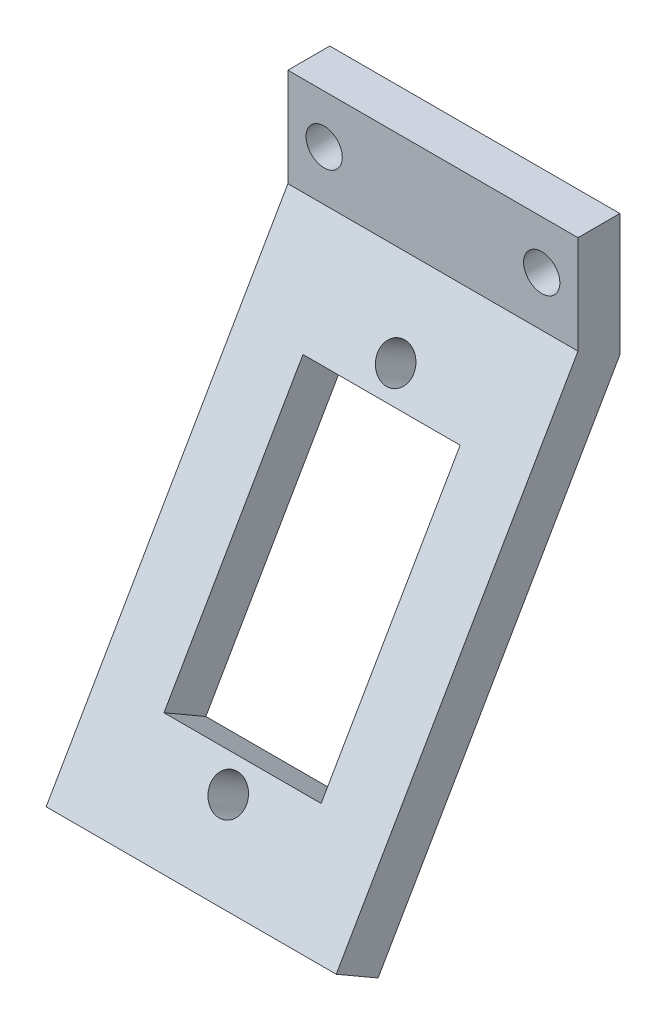
ISO-10303-21;
HEADER;
FILE_DESCRIPTION(('STEP AP214'),'2;1');
FILE_NAME('part.step','',(''),(''),'','','');
FILE_SCHEMA(('AUTOMOTIVE_DESIGN { 1 0 10303 214 1 1 1 1 }'));
ENDSEC;
DATA;
#1=APPLICATION_CONTEXT('core data for automotive mechanical design processes');
#2=APPLICATION_PROTOCOL_DEFINITION('international standard','automotive_design',2000,#1);
#3=PRODUCT_CONTEXT('',#1,'mechanical');
#4=PRODUCT('Part','Part','',(#3));
#5=PRODUCT_RELATED_PRODUCT_CATEGORY('part','',(#4));
#6=PRODUCT_DEFINITION_FORMATION('','',#4);
#7=PRODUCT_DEFINITION_CONTEXT('part definition',#1,'design');
#8=PRODUCT_DEFINITION('design','',#6,#7);
#9=PRODUCT_DEFINITION_SHAPE('','',#8);
#10=(LENGTH_UNIT() NAMED_UNIT(*) SI_UNIT(.MILLI.,.METRE.));
#11=(NAMED_UNIT(*) PLANE_ANGLE_UNIT() SI_UNIT($,.RADIAN.));
#12=(NAMED_UNIT(*) SI_UNIT($,.STERADIAN.) SOLID_ANGLE_UNIT());
#13=UNCERTAINTY_MEASURE_WITH_UNIT(LENGTH_MEASURE(1.E-05),#10,'distance_accuracy_value','');
#14=(GEOMETRIC_REPRESENTATION_CONTEXT(3) GLOBAL_UNCERTAINTY_ASSIGNED_CONTEXT((#13)) GLOBAL_UNIT_ASSIGNED_CONTEXT((#10,
#11,#12)) REPRESENTATION_CONTEXT('',''));
#15=CARTESIAN_POINT('',(0.,0.,0.));
#16=DIRECTION('',(0.,0.,1.));
#17=DIRECTION('',(1.,0.,0.));
#18=AXIS2_PLACEMENT_3D('',#15,#16,#17);
#19=CARTESIAN_POINT('',(0.,45.0000000000001,77.9422863405994));
#20=DIRECTION('',(0.,-0.500000000000001,-0.866025403784438));
#21=DIRECTION('',(0.,0.866025403784438,-0.500000000000001));
#22=AXIS2_PLACEMENT_3D('',#19,#20,#21);
#23=PLANE('',#22);
#24=CARTESIAN_POINT('',(0.,61.5410852122829,68.3922863405994));
#25=DIRECTION('',(0.,-0.500000000000001,-0.866025403784438));
#26=DIRECTION('',(0.,0.866025403784438,-0.500000000000001));
#27=AXIS2_PLACEMENT_3D('',#24,#25,#26);
#28=CIRCLE('',#27,1.5);
#29=CARTESIAN_POINT('',(0.,62.8401233179595,67.6422863405994));
#30=VERTEX_POINT('',#29);
#31=EDGE_CURVE('E158',#30,#30,#28,.T.);
#32=ORIENTED_EDGE('',*,*,#31,.T.);
#33=EDGE_LOOP('',(#32));
#34=FACE_BOUND('',#33,.T.);
#35=CARTESIAN_POINT('',(0.,37.5521815274539,82.2422863405994));
#36=DIRECTION('',(0.,-0.500000000000001,-0.866025403784438));
#37=DIRECTION('',(0.,0.866025403784438,-0.500000000000001));
#38=AXIS2_PLACEMENT_3D('',#35,#36,#37);
#39=CIRCLE('',#38,1.5);
#40=CARTESIAN_POINT('',(0.,38.8512196331306,81.4922863405994));
#41=VERTEX_POINT('',#40);
#42=EDGE_CURVE('E157',#41,#41,#39,.T.);
#43=ORIENTED_EDGE('',*,*,#42,.T.);
#44=EDGE_LOOP('',(#43));
#45=FACE_BOUND('',#44,.T.);
#46=DIRECTION('',(0.,-0.866025403784438,0.500000000000001));
#47=VECTOR('',#46,1.);
#48=CARTESIAN_POINT('',(-11.9901359135524,66.8671414455571,65.3172863405994));
#49=LINE('',#48,#47);
#50=CARTESIAN_POINT('',(-11.9901359135524,66.8671414455571,65.3172863405994));
#51=VERTEX_POINT('',#50);
#52=CARTESIAN_POINT('',(-11.9901359135524,32.2261252941796,85.3172863405994));
#53=VERTEX_POINT('',#52);
#54=EDGE_CURVE('E195',#51,#53,#49,.T.);
#55=ORIENTED_EDGE('',*,*,#54,.T.);
#56=DIRECTION('',(1.,0.,0.));
#57=VECTOR('',#56,1.);
#58=CARTESIAN_POINT('',(12.0098640864476,32.2261252941796,85.3172863405994));
#59=LINE('',#58,#57);
#60=CARTESIAN_POINT('',(12.0098640864476,32.2261252941796,85.3172863405994));
#61=VERTEX_POINT('',#60);
#62=EDGE_CURVE('E198',#53,#61,#59,.T.);
#63=ORIENTED_EDGE('',*,*,#62,.T.);
#64=DIRECTION('',(0.,0.866025403784438,-0.500000000000001));
#65=VECTOR('',#64,1.);
#66=CARTESIAN_POINT('',(12.0098640864476,66.8671414455571,65.3172863405994));
#67=LINE('',#66,#65);
#68=CARTESIAN_POINT('',(12.0098640864476,66.8671414455571,65.3172863405994));
#69=VERTEX_POINT('',#68);
#70=EDGE_CURVE('E201',#61,#69,#67,.T.);
#71=ORIENTED_EDGE('',*,*,#70,.T.);
#72=DIRECTION('',(-1.,0.,0.));
#73=VECTOR('',#72,1.);
#74=CARTESIAN_POINT('',(12.0098640864476,66.8671414455571,65.3172863405994));
#75=LINE('',#74,#73);
#76=EDGE_CURVE('E126',#69,#51,#75,.T.);
#77=ORIENTED_EDGE('',*,*,#76,.T.);
#78=EDGE_LOOP('',(#55,#63,#71,#77));
#79=FACE_BOUND('',#78,.T.);
#80=DIRECTION('',(0.,-0.866025403784438,0.500000000000001));
#81=VECTOR('',#80,1.);
#82=CARTESIAN_POINT('',(-6.49013591355237,59.5059255133894,69.5672863405994));
#83=LINE('',#82,#81);
#84=CARTESIAN_POINT('',(-6.49013591355237,59.5059255133894,69.5672863405994));
#85=VERTEX_POINT('',#84);
#86=CARTESIAN_POINT('',(-6.49013591355237,39.5873412263473,81.0672863405994));
#87=VERTEX_POINT('',#86);
#88=EDGE_CURVE('E169',#85,#87,#83,.T.);
#89=ORIENTED_EDGE('',*,*,#88,.F.);
#90=DIRECTION('',(-1.,0.,0.));
#91=VECTOR('',#90,1.);
#92=CARTESIAN_POINT('',(6.50986408644763,59.5059255133894,69.5672863405994));
#93=LINE('',#92,#91);
#94=CARTESIAN_POINT('',(6.50986408644763,59.5059255133894,69.5672863405994));
#95=VERTEX_POINT('',#94);
#96=EDGE_CURVE('E176',#95,#85,#93,.T.);
#97=ORIENTED_EDGE('',*,*,#96,.F.);
#98=DIRECTION('',(0.,0.866025403784438,-0.500000000000001));
#99=VECTOR('',#98,1.);
#100=CARTESIAN_POINT('',(6.50986408644763,59.5059255133894,69.5672863405994));
#101=LINE('',#100,#99);
#102=CARTESIAN_POINT('',(6.50986408644763,39.5873412263473,81.0672863405994));
#103=VERTEX_POINT('',#102);
#104=EDGE_CURVE('E174',#103,#95,#101,.T.);
#105=ORIENTED_EDGE('',*,*,#104,.F.);
#106=DIRECTION('',(1.,0.,0.));
#107=VECTOR('',#106,1.);
#108=CARTESIAN_POINT('',(6.50986408644763,39.5873412263473,81.0672863405994));
#109=LINE('',#108,#107);
#110=EDGE_CURVE('E171',#87,#103,#109,.T.);
#111=ORIENTED_EDGE('',*,*,#110,.F.);
#112=EDGE_LOOP('',(#89,#97,#105,#111));
#113=FACE_BOUND('',#112,.T.);
#114=ADVANCED_FACE('F38',(#34,#45,#79,#113),#23,.F.);
#115=CARTESIAN_POINT('',(0.,43.0000000000001,74.4781847254617));
#116=DIRECTION('',(0.,-0.500000000000001,-0.866025403784438));
#117=DIRECTION('',(0.,0.866025403784438,-0.500000000000001));
#118=AXIS2_PLACEMENT_3D('',#115,#116,#117);
#119=PLANE('',#118);
#120=CARTESIAN_POINT('',(0.,59.5410852122829,64.9281847254617));
#121=DIRECTION('',(0.,-0.500000000000001,-0.866025403784438));
#122=DIRECTION('',(0.,0.866025403784438,-0.500000000000001));
#123=AXIS2_PLACEMENT_3D('',#120,#121,#122);
#124=CIRCLE('',#123,1.5);
#125=CARTESIAN_POINT('',(0.,60.8401233179595,64.1781847254617));
#126=VERTEX_POINT('',#125);
#127=EDGE_CURVE('E161',#126,#126,#124,.T.);
#128=ORIENTED_EDGE('',*,*,#127,.F.);
#129=EDGE_LOOP('',(#128));
#130=FACE_BOUND('',#129,.T.);
#131=CARTESIAN_POINT('',(0.,35.5521815274539,78.7781847254617));
#132=DIRECTION('',(0.,-0.500000000000001,-0.866025403784438));
#133=DIRECTION('',(0.,0.866025403784438,-0.500000000000001));
#134=AXIS2_PLACEMENT_3D('',#131,#132,#133);
#135=CIRCLE('',#134,1.5);
#136=CARTESIAN_POINT('',(0.,36.8512196331306,78.0281847254617));
#137=VERTEX_POINT('',#136);
#138=EDGE_CURVE('E164',#137,#137,#135,.T.);
#139=ORIENTED_EDGE('',*,*,#138,.F.);
#140=EDGE_LOOP('',(#139));
#141=FACE_BOUND('',#140,.T.);
#142=DIRECTION('',(0.,-0.866025403784438,0.500000000000001));
#143=VECTOR('',#142,1.);
#144=CARTESIAN_POINT('',(-11.9901359135524,64.8671414455571,61.8531847254616));
#145=LINE('',#144,#143);
#146=CARTESIAN_POINT('',(-11.9901359135524,64.8671414455571,61.8531847254616));
#147=VERTEX_POINT('',#146);
#148=CARTESIAN_POINT('',(-11.9901359135524,30.2261252941796,81.8531847254617));
#149=VERTEX_POINT('',#148);
#150=EDGE_CURVE('E194',#147,#149,#145,.T.);
#151=ORIENTED_EDGE('',*,*,#150,.F.);
#152=DIRECTION('',(-1.,0.,0.));
#153=VECTOR('',#152,1.);
#154=CARTESIAN_POINT('',(12.0098640864476,64.8671414455571,61.8531847254616));
#155=LINE('',#154,#153);
#156=CARTESIAN_POINT('',(12.0098640864476,64.8671414455571,61.8531847254616));
#157=VERTEX_POINT('',#156);
#158=EDGE_CURVE('E199',#157,#147,#155,.T.);
#159=ORIENTED_EDGE('',*,*,#158,.F.);
#160=DIRECTION('',(0.,0.866025403784438,-0.500000000000001));
#161=VECTOR('',#160,1.);
#162=CARTESIAN_POINT('',(12.0098640864476,64.8671414455571,61.8531847254616));
#163=LINE('',#162,#161);
#164=CARTESIAN_POINT('',(12.0098640864476,30.2261252941796,81.8531847254617));
#165=VERTEX_POINT('',#164);
#166=EDGE_CURVE('E208',#165,#157,#163,.T.);
#167=ORIENTED_EDGE('',*,*,#166,.F.);
#168=DIRECTION('',(1.,0.,0.));
#169=VECTOR('',#168,1.);
#170=CARTESIAN_POINT('',(12.0098640864476,30.2261252941796,81.8531847254617));
#171=LINE('',#170,#169);
#172=EDGE_CURVE('E206',#149,#165,#171,.T.);
#173=ORIENTED_EDGE('',*,*,#172,.F.);
#174=EDGE_LOOP('',(#151,#159,#167,#173));
#175=FACE_BOUND('',#174,.T.);
#176=DIRECTION('',(-1.,0.,0.));
#177=VECTOR('',#176,1.);
#178=CARTESIAN_POINT('',(6.50986408644763,57.5059255133894,66.1031847254616));
#179=LINE('',#178,#177);
#180=CARTESIAN_POINT('',(6.50986408644763,57.5059255133894,66.1031847254616));
#181=VERTEX_POINT('',#180);
#182=CARTESIAN_POINT('',(-6.49013591355237,57.5059255133894,66.1031847254617));
#183=VERTEX_POINT('',#182);
#184=EDGE_CURVE('E172',#181,#183,#179,.T.);
#185=ORIENTED_EDGE('',*,*,#184,.T.);
#186=DIRECTION('',(0.,-0.866025403784438,0.500000000000001));
#187=VECTOR('',#186,1.);
#188=CARTESIAN_POINT('',(-6.49013591355237,57.5059255133894,66.1031847254616));
#189=LINE('',#188,#187);
#190=CARTESIAN_POINT('',(-6.49013591355237,37.5873412263473,77.6031847254617));
#191=VERTEX_POINT('',#190);
#192=EDGE_CURVE('E63',#183,#191,#189,.T.);
#193=ORIENTED_EDGE('',*,*,#192,.T.);
#194=DIRECTION('',(1.,0.,0.));
#195=VECTOR('',#194,1.);
#196=CARTESIAN_POINT('',(6.50986408644763,37.5873412263473,77.6031847254617));
#197=LINE('',#196,#195);
#198=CARTESIAN_POINT('',(6.50986408644763,37.5873412263473,77.6031847254617));
#199=VERTEX_POINT('',#198);
#200=EDGE_CURVE('E180',#191,#199,#197,.T.);
#201=ORIENTED_EDGE('',*,*,#200,.T.);
#202=DIRECTION('',(0.,0.866025403784438,-0.500000000000001));
#203=VECTOR('',#202,1.);
#204=CARTESIAN_POINT('',(6.50986408644763,57.5059255133894,66.1031847254616));
#205=LINE('',#204,#203);
#206=EDGE_CURVE('E183',#199,#181,#205,.T.);
#207=ORIENTED_EDGE('',*,*,#206,.T.);
#208=EDGE_LOOP('',(#185,#193,#201,#207));
#209=FACE_BOUND('',#208,.T.);
#210=ADVANCED_FACE('F242',(#130,#141,#175,#209),#119,.T.);
#211=CARTESIAN_POINT('',(-11.9901359135524,66.8671414455571,65.3172863405994));
#212=DIRECTION('',(1.,0.,0.));
#213=DIRECTION('',(0.,0.,-1.));
#214=AXIS2_PLACEMENT_3D('',#211,#212,#213);
#215=PLANE('',#214);
#216=ORIENTED_EDGE('',*,*,#150,.T.);
#217=DIRECTION('',(0.,-0.500000000000001,-0.866025403784438));
#218=VECTOR('',#217,1.);
#219=CARTESIAN_POINT('',(-11.9901359135524,32.2261252941796,85.3172863405994));
#220=LINE('',#219,#218);
#221=EDGE_CURVE('E11',#53,#149,#220,.T.);
#222=ORIENTED_EDGE('',*,*,#221,.F.);
#223=ORIENTED_EDGE('',*,*,#54,.F.);
#224=DIRECTION('',(0.,1.,0.));
#225=VECTOR('',#224,1.);
#226=CARTESIAN_POINT('',(-11.9901359135524,39.742785792575,65.3172863405994));
#227=LINE('',#226,#225);
#228=CARTESIAN_POINT('',(-11.9901359135524,75.,65.3172863405994));
#229=VERTEX_POINT('',#228);
#230=EDGE_CURVE('E130',#51,#229,#227,.T.);
#231=ORIENTED_EDGE('',*,*,#230,.T.);
#232=DIRECTION('',(0.,0.,1.));
#233=VECTOR('',#232,1.);
#234=CARTESIAN_POINT('',(-11.9901359135524,75.,61.8531847254616));
#235=LINE('',#234,#233);
#236=CARTESIAN_POINT('',(-11.9901359135524,75.,61.8531847254616));
#237=VERTEX_POINT('',#236);
#238=EDGE_CURVE('E145',#237,#229,#235,.T.);
#239=ORIENTED_EDGE('',*,*,#238,.F.);
#240=DIRECTION('',(0.,1.,0.));
#241=VECTOR('',#240,1.);
#242=CARTESIAN_POINT('',(-11.9901359135524,39.742785792575,61.8531847254616));
#243=LINE('',#242,#241);
#244=EDGE_CURVE('E146',#147,#237,#243,.T.);
#245=ORIENTED_EDGE('',*,*,#244,.F.);
#246=EDGE_LOOP('',(#216,#222,#223,#231,#239,#245));
#247=FACE_BOUND('',#246,.T.);
#248=ADVANCED_FACE('F40',(#247),#215,.F.);
#249=CARTESIAN_POINT('',(12.0098640864476,32.2261252941796,85.3172863405994));
#250=DIRECTION('',(0.,0.866025403784438,-0.500000000000001));
#251=DIRECTION('',(0.,0.500000000000001,0.866025403784438));
#252=AXIS2_PLACEMENT_3D('',#249,#250,#251);
#253=PLANE('',#252);
#254=ORIENTED_EDGE('',*,*,#172,.T.);
#255=DIRECTION('',(0.,-0.500000000000001,-0.866025403784438));
#256=VECTOR('',#255,1.);
#257=CARTESIAN_POINT('',(12.0098640864476,32.2261252941796,85.3172863405994));
#258=LINE('',#257,#256);
#259=EDGE_CURVE('E47',#61,#165,#258,.T.);
#260=ORIENTED_EDGE('',*,*,#259,.F.);
#261=ORIENTED_EDGE('',*,*,#62,.F.);
#262=ORIENTED_EDGE('',*,*,#221,.T.);
#263=EDGE_LOOP('',(#254,#260,#261,#262));
#264=FACE_BOUND('',#263,.T.);
#265=ADVANCED_FACE('F244',(#264),#253,.F.);
#266=CARTESIAN_POINT('',(12.0098640864476,66.8671414455571,65.3172863405994));
#267=DIRECTION('',(-1.,0.,0.));
#268=DIRECTION('',(0.,0.,1.));
#269=AXIS2_PLACEMENT_3D('',#266,#267,#268);
#270=PLANE('',#269);
#271=ORIENTED_EDGE('',*,*,#166,.T.);
#272=DIRECTION('',(0.,1.,0.));
#273=VECTOR('',#272,1.);
#274=CARTESIAN_POINT('',(12.0098640864476,39.742785792575,61.8531847254616));
#275=LINE('',#274,#273);
#276=CARTESIAN_POINT('',(12.0098640864476,75.,61.8531847254616));
#277=VERTEX_POINT('',#276);
#278=EDGE_CURVE('E129',#157,#277,#275,.T.);
#279=ORIENTED_EDGE('',*,*,#278,.T.);
#280=DIRECTION('',(0.,0.,-1.));
#281=VECTOR('',#280,1.);
#282=CARTESIAN_POINT('',(12.0098640864476,75.,65.3172863405994));
#283=LINE('',#282,#281);
#284=CARTESIAN_POINT('',(12.0098640864476,75.,65.3172863405994));
#285=VERTEX_POINT('',#284);
#286=EDGE_CURVE('E133',#285,#277,#283,.T.);
#287=ORIENTED_EDGE('',*,*,#286,.F.);
#288=DIRECTION('',(0.,1.,0.));
#289=VECTOR('',#288,1.);
#290=CARTESIAN_POINT('',(12.0098640864476,39.742785792575,65.3172863405994));
#291=LINE('',#290,#289);
#292=EDGE_CURVE('E120',#69,#285,#291,.T.);
#293=ORIENTED_EDGE('',*,*,#292,.F.);
#294=ORIENTED_EDGE('',*,*,#70,.F.);
#295=ORIENTED_EDGE('',*,*,#259,.T.);
#296=EDGE_LOOP('',(#271,#279,#287,#293,#294,#295));
#297=FACE_BOUND('',#296,.T.);
#298=ADVANCED_FACE('F135',(#297),#270,.F.);
#299=CARTESIAN_POINT('',(-6.49013591355237,59.5059255133894,69.5672863405994));
#300=DIRECTION('',(1.,0.,0.));
#301=DIRECTION('',(0.,1.,0.));
#302=AXIS2_PLACEMENT_3D('',#299,#300,#301);
#303=PLANE('',#302);
#304=ORIENTED_EDGE('',*,*,#192,.F.);
#305=DIRECTION('',(0.,-0.500000000000001,-0.866025403784438));
#306=VECTOR('',#305,1.);
#307=CARTESIAN_POINT('',(-6.49013591355237,59.5059255133894,69.5672863405994));
#308=LINE('',#307,#306);
#309=EDGE_CURVE('E178',#85,#183,#308,.T.);
#310=ORIENTED_EDGE('',*,*,#309,.F.);
#311=ORIENTED_EDGE('',*,*,#88,.T.);
#312=DIRECTION('',(0.,-0.500000000000001,-0.866025403784438));
#313=VECTOR('',#312,1.);
#314=CARTESIAN_POINT('',(-6.49013591355237,39.5873412263473,81.0672863405994));
#315=LINE('',#314,#313);
#316=EDGE_CURVE('E192',#87,#191,#315,.T.);
#317=ORIENTED_EDGE('',*,*,#316,.T.);
#318=EDGE_LOOP('',(#304,#310,#311,#317));
#319=FACE_BOUND('',#318,.T.);
#320=ADVANCED_FACE('F250',(#319),#303,.T.);
#321=CARTESIAN_POINT('',(6.50986408644763,39.5873412263473,81.0672863405994));
#322=DIRECTION('',(0.,0.866025403784438,-0.500000000000001));
#323=DIRECTION('',(0.,0.500000000000001,0.866025403784438));
#324=AXIS2_PLACEMENT_3D('',#321,#322,#323);
#325=PLANE('',#324);
#326=ORIENTED_EDGE('',*,*,#200,.F.);
#327=ORIENTED_EDGE('',*,*,#316,.F.);
#328=ORIENTED_EDGE('',*,*,#110,.T.);
#329=DIRECTION('',(0.,-0.500000000000001,-0.866025403784438));
#330=VECTOR('',#329,1.);
#331=CARTESIAN_POINT('',(6.50986408644763,39.5873412263473,81.0672863405994));
#332=LINE('',#331,#330);
#333=EDGE_CURVE('E190',#103,#199,#332,.T.);
#334=ORIENTED_EDGE('',*,*,#333,.T.);
#335=EDGE_LOOP('',(#326,#327,#328,#334));
#336=FACE_BOUND('',#335,.T.);
#337=ADVANCED_FACE('F264',(#336),#325,.T.);
#338=CARTESIAN_POINT('',(6.50986408644763,59.5059255133894,69.5672863405994));
#339=DIRECTION('',(-1.,0.,0.));
#340=DIRECTION('',(0.,0.,1.));
#341=AXIS2_PLACEMENT_3D('',#338,#339,#340);
#342=PLANE('',#341);
#343=ORIENTED_EDGE('',*,*,#206,.F.);
#344=ORIENTED_EDGE('',*,*,#333,.F.);
#345=ORIENTED_EDGE('',*,*,#104,.T.);
#346=DIRECTION('',(0.,-0.500000000000001,-0.866025403784438));
#347=VECTOR('',#346,1.);
#348=CARTESIAN_POINT('',(6.50986408644763,59.5059255133894,69.5672863405994));
#349=LINE('',#348,#347);
#350=EDGE_CURVE('E55',#95,#181,#349,.T.);
#351=ORIENTED_EDGE('',*,*,#350,.T.);
#352=EDGE_LOOP('',(#343,#344,#345,#351));
#353=FACE_BOUND('',#352,.T.);
#354=ADVANCED_FACE('F267',(#353),#342,.T.);
#355=CARTESIAN_POINT('',(6.50986408644763,59.5059255133894,69.5672863405994));
#356=DIRECTION('',(0.,-0.866025403784438,0.500000000000001));
#357=DIRECTION('',(0.,-0.500000000000001,-0.866025403784438));
#358=AXIS2_PLACEMENT_3D('',#355,#356,#357);
#359=PLANE('',#358);
#360=ORIENTED_EDGE('',*,*,#184,.F.);
#361=ORIENTED_EDGE('',*,*,#350,.F.);
#362=ORIENTED_EDGE('',*,*,#96,.T.);
#363=ORIENTED_EDGE('',*,*,#309,.T.);
#364=EDGE_LOOP('',(#360,#361,#362,#363));
#365=FACE_BOUND('',#364,.T.);
#366=ADVANCED_FACE('F271',(#365),#359,.T.);
#367=CARTESIAN_POINT('',(0.,37.5521815274539,82.2422863405994));
#368=DIRECTION('',(0.,-0.500000000000001,-0.866025403784438));
#369=DIRECTION('',(0.,0.866025403784438,-0.500000000000001));
#370=AXIS2_PLACEMENT_3D('',#367,#368,#369);
#371=CYLINDRICAL_SURFACE('',#370,1.5);
#372=ORIENTED_EDGE('',*,*,#42,.F.);
#373=EDGE_LOOP('',(#372));
#374=FACE_BOUND('',#373,.T.);
#375=ORIENTED_EDGE('',*,*,#138,.T.);
#376=EDGE_LOOP('',(#375));
#377=FACE_BOUND('',#376,.T.);
#378=ADVANCED_FACE('F275',(#374,#377),#371,.F.);
#379=CARTESIAN_POINT('',(0.,61.5410852122829,68.3922863405994));
#380=DIRECTION('',(0.,-0.500000000000001,-0.866025403784438));
#381=DIRECTION('',(0.,0.866025403784438,-0.500000000000001));
#382=AXIS2_PLACEMENT_3D('',#379,#380,#381);
#383=CYLINDRICAL_SURFACE('',#382,1.5);
#384=ORIENTED_EDGE('',*,*,#31,.F.);
#385=EDGE_LOOP('',(#384));
#386=FACE_BOUND('',#385,.T.);
#387=ORIENTED_EDGE('',*,*,#127,.T.);
#388=EDGE_LOOP('',(#387));
#389=FACE_BOUND('',#388,.T.);
#390=ADVANCED_FACE('F278',(#386,#389),#383,.F.);
#391=CARTESIAN_POINT('',(0.,75.,0.));
#392=DIRECTION('',(0.,1.,0.));
#393=DIRECTION('',(0.,0.,1.));
#394=AXIS2_PLACEMENT_3D('',#391,#392,#393);
#395=PLANE('',#394);
#396=ORIENTED_EDGE('',*,*,#286,.T.);
#397=DIRECTION('',(-1.,0.,0.));
#398=VECTOR('',#397,1.);
#399=CARTESIAN_POINT('',(12.0098640864476,75.,61.8531847254616));
#400=LINE('',#399,#398);
#401=EDGE_CURVE('E140',#277,#237,#400,.T.);
#402=ORIENTED_EDGE('',*,*,#401,.T.);
#403=ORIENTED_EDGE('',*,*,#238,.T.);
#404=DIRECTION('',(1.,0.,0.));
#405=VECTOR('',#404,1.);
#406=CARTESIAN_POINT('',(-11.9901359135524,75.,65.3172863405994));
#407=LINE('',#406,#405);
#408=EDGE_CURVE('E125',#229,#285,#407,.T.);
#409=ORIENTED_EDGE('',*,*,#408,.T.);
#410=EDGE_LOOP('',(#396,#402,#403,#409));
#411=FACE_BOUND('',#410,.T.);
#412=ADVANCED_FACE('F143',(#411),#395,.T.);
#413=CARTESIAN_POINT('',(12.0098640864476,39.742785792575,61.8531847254616));
#414=DIRECTION('',(0.,0.,-1.));
#415=DIRECTION('',(-1.,0.,0.));
#416=AXIS2_PLACEMENT_3D('',#413,#414,#415);
#417=PLANE('',#416);
#418=CARTESIAN_POINT('',(9.00986408644763,71.,61.8531847254616));
#419=DIRECTION('',(0.,0.,-1.));
#420=DIRECTION('',(-1.,0.,0.));
#421=AXIS2_PLACEMENT_3D('',#418,#419,#420);
#422=CIRCLE('',#421,1.5);
#423=CARTESIAN_POINT('',(7.50986408644763,71.,61.8531847254616));
#424=VERTEX_POINT('',#423);
#425=EDGE_CURVE('E215',#424,#424,#422,.T.);
#426=ORIENTED_EDGE('',*,*,#425,.F.);
#427=EDGE_LOOP('',(#426));
#428=FACE_BOUND('',#427,.T.);
#429=CARTESIAN_POINT('',(-8.99013591355237,71.,61.8531847254616));
#430=DIRECTION('',(0.,0.,-1.));
#431=DIRECTION('',(-1.,0.,0.));
#432=AXIS2_PLACEMENT_3D('',#429,#430,#431);
#433=CIRCLE('',#432,1.5);
#434=CARTESIAN_POINT('',(-10.4901359135524,71.,61.8531847254616));
#435=VERTEX_POINT('',#434);
#436=EDGE_CURVE('E151',#435,#435,#433,.T.);
#437=ORIENTED_EDGE('',*,*,#436,.F.);
#438=EDGE_LOOP('',(#437));
#439=FACE_BOUND('',#438,.T.);
#440=ORIENTED_EDGE('',*,*,#278,.F.);
#441=ORIENTED_EDGE('',*,*,#158,.T.);
#442=ORIENTED_EDGE('',*,*,#244,.T.);
#443=ORIENTED_EDGE('',*,*,#401,.F.);
#444=EDGE_LOOP('',(#440,#441,#442,#443));
#445=FACE_BOUND('',#444,.T.);
#446=ADVANCED_FACE('F227',(#428,#439,#445),#417,.T.);
#447=CARTESIAN_POINT('',(-11.9901359135524,39.742785792575,65.3172863405994));
#448=DIRECTION('',(0.,0.,1.));
#449=DIRECTION('',(1.,0.,0.));
#450=AXIS2_PLACEMENT_3D('',#447,#448,#449);
#451=PLANE('',#450);
#452=CARTESIAN_POINT('',(9.00986408644763,71.,65.3172863405994));
#453=DIRECTION('',(0.,0.,1.));
#454=DIRECTION('',(1.,0.,0.));
#455=AXIS2_PLACEMENT_3D('',#452,#453,#454);
#456=CIRCLE('',#455,1.5);
#457=CARTESIAN_POINT('',(10.5098640864476,71.,65.3172863405994));
#458=VERTEX_POINT('',#457);
#459=EDGE_CURVE('E42',#458,#458,#456,.T.);
#460=ORIENTED_EDGE('',*,*,#459,.F.);
#461=EDGE_LOOP('',(#460));
#462=FACE_BOUND('',#461,.T.);
#463=CARTESIAN_POINT('',(-8.99013591355237,71.,65.3172863405994));
#464=DIRECTION('',(0.,0.,1.));
#465=DIRECTION('',(1.,0.,0.));
#466=AXIS2_PLACEMENT_3D('',#463,#464,#465);
#467=CIRCLE('',#466,1.5);
#468=CARTESIAN_POINT('',(-7.49013591355237,71.,65.3172863405994));
#469=VERTEX_POINT('',#468);
#470=EDGE_CURVE('E213',#469,#469,#467,.T.);
#471=ORIENTED_EDGE('',*,*,#470,.F.);
#472=EDGE_LOOP('',(#471));
#473=FACE_BOUND('',#472,.T.);
#474=ORIENTED_EDGE('',*,*,#230,.F.);
#475=ORIENTED_EDGE('',*,*,#76,.F.);
#476=ORIENTED_EDGE('',*,*,#292,.T.);
#477=ORIENTED_EDGE('',*,*,#408,.F.);
#478=EDGE_LOOP('',(#474,#475,#476,#477));
#479=FACE_BOUND('',#478,.T.);
#480=ADVANCED_FACE('F123',(#462,#473,#479),#451,.T.);
#481=CARTESIAN_POINT('',(-8.99013591355237,71.,65.8531847254616));
#482=DIRECTION('',(0.,0.,-1.));
#483=DIRECTION('',(-1.,0.,0.));
#484=AXIS2_PLACEMENT_3D('',#481,#482,#483);
#485=CYLINDRICAL_SURFACE('',#484,1.5);
#486=ORIENTED_EDGE('',*,*,#470,.T.);
#487=EDGE_LOOP('',(#486));
#488=FACE_BOUND('',#487,.T.);
#489=ORIENTED_EDGE('',*,*,#436,.T.);
#490=EDGE_LOOP('',(#489));
#491=FACE_BOUND('',#490,.T.);
#492=ADVANCED_FACE('F225',(#488,#491),#485,.F.);
#493=CARTESIAN_POINT('',(9.00986408644763,71.,65.8531847254616));
#494=DIRECTION('',(0.,0.,-1.));
#495=DIRECTION('',(-1.,0.,0.));
#496=AXIS2_PLACEMENT_3D('',#493,#494,#495);
#497=CYLINDRICAL_SURFACE('',#496,1.5);
#498=ORIENTED_EDGE('',*,*,#459,.T.);
#499=EDGE_LOOP('',(#498));
#500=FACE_BOUND('',#499,.T.);
#501=ORIENTED_EDGE('',*,*,#425,.T.);
#502=EDGE_LOOP('',(#501));
#503=FACE_BOUND('',#502,.T.);
#504=ADVANCED_FACE('F290',(#500,#503),#497,.F.);
#505=CLOSED_SHELL('',(#114,#210,#248,#265,#298,#320,#337,#354,#366,#378,#390,#412,#446,#480,
#492,#504));
#506=MANIFOLD_SOLID_BREP('B2',#505);
#507=ADVANCED_BREP_SHAPE_REPRESENTATION('',(#18,#506),#14);
#508=SHAPE_DEFINITION_REPRESENTATION(#9,#507);
ENDSEC;
END-ISO-10303-21;
